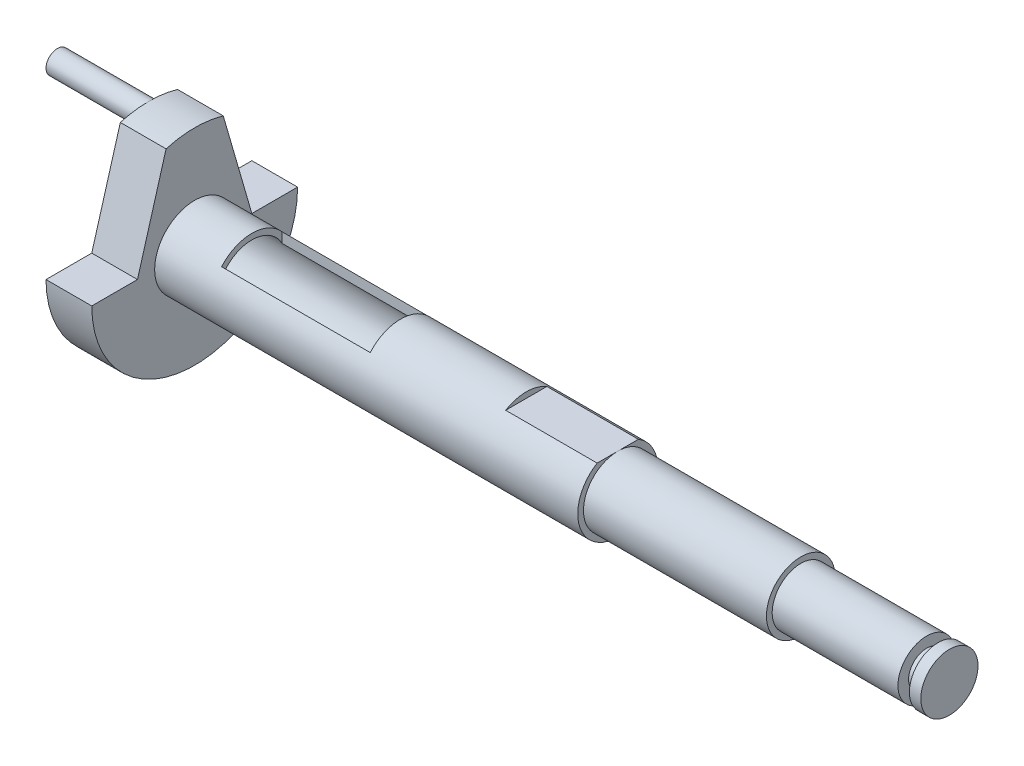
ISO-10303-21;
HEADER;
FILE_DESCRIPTION(('STEP AP214'),'2;1');
FILE_NAME('part.step','',(''),(''),'','','');
FILE_SCHEMA(('AUTOMOTIVE_DESIGN { 1 0 10303 214 1 1 1 1 }'));
ENDSEC;
DATA;
#1=APPLICATION_CONTEXT('core data for automotive mechanical design processes');
#2=APPLICATION_PROTOCOL_DEFINITION('international standard','automotive_design',2000,#1);
#3=PRODUCT_CONTEXT('',#1,'mechanical');
#4=PRODUCT('Part','Part','',(#3));
#5=PRODUCT_RELATED_PRODUCT_CATEGORY('part','',(#4));
#6=PRODUCT_DEFINITION_FORMATION('','',#4);
#7=PRODUCT_DEFINITION_CONTEXT('part definition',#1,'design');
#8=PRODUCT_DEFINITION('design','',#6,#7);
#9=PRODUCT_DEFINITION_SHAPE('','',#8);
#10=(LENGTH_UNIT() NAMED_UNIT(*) SI_UNIT(.MILLI.,.METRE.));
#11=(NAMED_UNIT(*) PLANE_ANGLE_UNIT() SI_UNIT($,.RADIAN.));
#12=(NAMED_UNIT(*) SI_UNIT($,.STERADIAN.) SOLID_ANGLE_UNIT());
#13=UNCERTAINTY_MEASURE_WITH_UNIT(LENGTH_MEASURE(1.E-05),#10,'distance_accuracy_value','');
#14=(GEOMETRIC_REPRESENTATION_CONTEXT(3) GLOBAL_UNCERTAINTY_ASSIGNED_CONTEXT((#13)) GLOBAL_UNIT_ASSIGNED_CONTEXT((#10,
#11,#12)) REPRESENTATION_CONTEXT('',''));
#15=CARTESIAN_POINT('',(0.,0.,0.));
#16=DIRECTION('',(0.,0.,1.));
#17=DIRECTION('',(1.,0.,0.));
#18=AXIS2_PLACEMENT_3D('',#15,#16,#17);
#19=CARTESIAN_POINT('',(-65.,0.,0.));
#20=DIRECTION('',(-1.,0.,0.));
#21=DIRECTION('',(0.,0.,1.));
#22=AXIS2_PLACEMENT_3D('',#19,#20,#21);
#23=PLANE('',#22);
#24=CARTESIAN_POINT('',(-65.,0.,0.));
#25=DIRECTION('',(-1.,0.,0.));
#26=DIRECTION('',(0.,0.,1.));
#27=AXIS2_PLACEMENT_3D('',#24,#25,#26);
#28=CIRCLE('',#27,3.5);
#29=CARTESIAN_POINT('',(-65.,0.,3.50000000000001));
#30=VERTEX_POINT('',#29);
#31=EDGE_CURVE('E193',#30,#30,#28,.T.);
#32=ORIENTED_EDGE('',*,*,#31,.T.);
#33=EDGE_LOOP('',(#32));
#34=FACE_BOUND('',#33,.T.);
#35=CARTESIAN_POINT('',(-65.,0.,0.));
#36=DIRECTION('',(-1.,0.,0.));
#37=DIRECTION('',(0.,0.,1.));
#38=AXIS2_PLACEMENT_3D('',#35,#36,#37);
#39=CIRCLE('',#38,9.);
#40=CARTESIAN_POINT('',(-65.,0.,-9.));
#41=VERTEX_POINT('',#40);
#42=CARTESIAN_POINT('',(-65.,0.,8.99999999999994));
#43=VERTEX_POINT('',#42);
#44=EDGE_CURVE('E158',#41,#43,#39,.T.);
#45=ORIENTED_EDGE('',*,*,#44,.F.);
#46=DIRECTION('',(0.,0.,1.));
#47=VECTOR('',#46,1.);
#48=CARTESIAN_POINT('',(-65.,0.,0.));
#49=LINE('',#48,#47);
#50=CARTESIAN_POINT('',(-65.,0.,-5.));
#51=VERTEX_POINT('',#50);
#52=EDGE_CURVE('E535',#41,#51,#49,.T.);
#53=ORIENTED_EDGE('',*,*,#52,.T.);
#54=DIRECTION('',(0.,0.960645359210589,0.277777777777778));
#55=VECTOR('',#54,1.);
#56=CARTESIAN_POINT('',(-65.,1.33422966557028,-4.61419753086421));
#57=LINE('',#56,#55);
#58=CARTESIAN_POINT('',(-65.,8.64580823289532,-2.5));
#59=VERTEX_POINT('',#58);
#60=EDGE_CURVE('E538',#51,#59,#57,.T.);
#61=ORIENTED_EDGE('',*,*,#60,.T.);
#62=CARTESIAN_POINT('',(-65.,8.6458082328953,2.49999999999995));
#63=VERTEX_POINT('',#62);
#64=EDGE_CURVE('E153',#63,#59,#39,.T.);
#65=ORIENTED_EDGE('',*,*,#64,.F.);
#66=DIRECTION('',(0.,0.960645359210589,-0.277777777777778));
#67=VECTOR('',#66,1.);
#68=CARTESIAN_POINT('',(-65.,1.33422966557026,4.61419753086419));
#69=LINE('',#68,#67);
#70=CARTESIAN_POINT('',(-65.,0.,4.99999999999994));
#71=VERTEX_POINT('',#70);
#72=EDGE_CURVE('E552',#71,#63,#69,.T.);
#73=ORIENTED_EDGE('',*,*,#72,.F.);
#74=DIRECTION('',(0.,0.,-1.));
#75=VECTOR('',#74,1.);
#76=CARTESIAN_POINT('',(-65.,0.,0.));
#77=LINE('',#76,#75);
#78=EDGE_CURVE('E554',#43,#71,#77,.T.);
#79=ORIENTED_EDGE('',*,*,#78,.F.);
#80=EDGE_LOOP('',(#45,#53,#61,#65,#73,#79));
#81=FACE_BOUND('',#80,.T.);
#82=ADVANCED_FACE('F40',(#34,#81),#23,.F.);
#83=CARTESIAN_POINT('',(-69.,0.,0.));
#84=DIRECTION('',(-1.,0.,0.));
#85=DIRECTION('',(0.,0.,1.));
#86=AXIS2_PLACEMENT_3D('',#83,#84,#85);
#87=PLANE('',#86);
#88=CARTESIAN_POINT('',(-69.,0.,0.));
#89=DIRECTION('',(-1.,0.,0.));
#90=DIRECTION('',(0.,0.,1.));
#91=AXIS2_PLACEMENT_3D('',#88,#89,#90);
#92=CIRCLE('',#91,9.);
#93=CARTESIAN_POINT('',(-69.,8.6458082328953,2.49999999999995));
#94=VERTEX_POINT('',#93);
#95=CARTESIAN_POINT('',(-69.,9.,0.));
#96=VERTEX_POINT('',#95);
#97=EDGE_CURVE('E136',#94,#96,#92,.T.);
#98=ORIENTED_EDGE('',*,*,#97,.T.);
#99=CARTESIAN_POINT('',(-69.,8.00000000000006,0.));
#100=DIRECTION('',(-1.,0.,0.));
#101=DIRECTION('',(0.,0.,1.));
#102=AXIS2_PLACEMENT_3D('',#99,#100,#101);
#103=CIRCLE('',#102,1.);
#104=EDGE_CURVE('E140',#96,#96,#103,.T.);
#105=ORIENTED_EDGE('',*,*,#104,.F.);
#106=CARTESIAN_POINT('',(-69.,8.64580823289532,-2.5));
#107=VERTEX_POINT('',#106);
#108=EDGE_CURVE('E55',#96,#107,#92,.T.);
#109=ORIENTED_EDGE('',*,*,#108,.T.);
#110=DIRECTION('',(0.,0.960645359210589,0.277777777777778));
#111=VECTOR('',#110,1.);
#112=CARTESIAN_POINT('',(-69.,1.33422966557028,-4.61419753086421));
#113=LINE('',#112,#111);
#114=CARTESIAN_POINT('',(-69.,0.,-5.));
#115=VERTEX_POINT('',#114);
#116=EDGE_CURVE('E539',#115,#107,#113,.T.);
#117=ORIENTED_EDGE('',*,*,#116,.F.);
#118=DIRECTION('',(0.,0.,1.));
#119=VECTOR('',#118,1.);
#120=CARTESIAN_POINT('',(-69.,0.,0.));
#121=LINE('',#120,#119);
#122=CARTESIAN_POINT('',(-69.,0.,-9.));
#123=VERTEX_POINT('',#122);
#124=EDGE_CURVE('E543',#123,#115,#121,.T.);
#125=ORIENTED_EDGE('',*,*,#124,.F.);
#126=CARTESIAN_POINT('',(-69.,0.,8.99999999999994));
#127=VERTEX_POINT('',#126);
#128=EDGE_CURVE('E147',#123,#127,#92,.T.);
#129=ORIENTED_EDGE('',*,*,#128,.T.);
#130=DIRECTION('',(0.,0.,-1.));
#131=VECTOR('',#130,1.);
#132=CARTESIAN_POINT('',(-69.,0.,0.));
#133=LINE('',#132,#131);
#134=CARTESIAN_POINT('',(-69.,0.,4.99999999999994));
#135=VERTEX_POINT('',#134);
#136=EDGE_CURVE('E63',#127,#135,#133,.T.);
#137=ORIENTED_EDGE('',*,*,#136,.T.);
#138=DIRECTION('',(0.,0.960645359210589,-0.277777777777778));
#139=VECTOR('',#138,1.);
#140=CARTESIAN_POINT('',(-69.,1.33422966557026,4.61419753086419));
#141=LINE('',#140,#139);
#142=EDGE_CURVE('E142',#135,#94,#141,.T.);
#143=ORIENTED_EDGE('',*,*,#142,.T.);
#144=EDGE_LOOP('',(#98,#105,#109,#117,#125,#129,#137,#143));
#145=FACE_BOUND('',#144,.T.);
#146=CARTESIAN_POINT('',(-69.,0.,0.));
#147=DIRECTION('',(-1.,0.,0.));
#148=DIRECTION('',(0.,0.,1.));
#149=AXIS2_PLACEMENT_3D('',#146,#147,#148);
#150=CIRCLE('',#149,3.);
#151=CARTESIAN_POINT('',(-69.,0.,3.00000000000001));
#152=VERTEX_POINT('',#151);
#153=EDGE_CURVE('E156',#152,#152,#150,.T.);
#154=ORIENTED_EDGE('',*,*,#153,.F.);
#155=EDGE_LOOP('',(#154));
#156=FACE_BOUND('',#155,.T.);
#157=ADVANCED_FACE('F137',(#145,#156),#87,.T.);
#158=CARTESIAN_POINT('',(-69.,0.,0.));
#159=DIRECTION('',(1.,0.,0.));
#160=DIRECTION('',(0.,0.,-1.));
#161=AXIS2_PLACEMENT_3D('',#158,#159,#160);
#162=CYLINDRICAL_SURFACE('',#161,9.);
#163=ORIENTED_EDGE('',*,*,#128,.F.);
#164=DIRECTION('',(-1.,0.,0.));
#165=VECTOR('',#164,1.);
#166=CARTESIAN_POINT('',(-65.,0.,-9.));
#167=LINE('',#166,#165);
#168=EDGE_CURVE('E548',#41,#123,#167,.T.);
#169=ORIENTED_EDGE('',*,*,#168,.F.);
#170=ORIENTED_EDGE('',*,*,#44,.T.);
#171=DIRECTION('',(-1.,0.,0.));
#172=VECTOR('',#171,1.);
#173=CARTESIAN_POINT('',(-65.,0.,8.99999999999994));
#174=LINE('',#173,#172);
#175=EDGE_CURVE('E559',#43,#127,#174,.T.);
#176=ORIENTED_EDGE('',*,*,#175,.T.);
#177=EDGE_LOOP('',(#163,#169,#170,#176));
#178=FACE_BOUND('',#177,.T.);
#179=ADVANCED_FACE('F265',(#178),#162,.T.);
#180=ORIENTED_EDGE('',*,*,#64,.T.);
#181=DIRECTION('',(-1.,0.,0.));
#182=VECTOR('',#181,1.);
#183=CARTESIAN_POINT('',(-65.,8.64580823289532,-2.5));
#184=LINE('',#183,#182);
#185=EDGE_CURVE('E151',#59,#107,#184,.T.);
#186=ORIENTED_EDGE('',*,*,#185,.T.);
#187=ORIENTED_EDGE('',*,*,#108,.F.);
#188=ORIENTED_EDGE('',*,*,#97,.F.);
#189=DIRECTION('',(-1.,0.,0.));
#190=VECTOR('',#189,1.);
#191=CARTESIAN_POINT('',(-65.,8.6458082328953,2.49999999999995));
#192=LINE('',#191,#190);
#193=EDGE_CURVE('E546',#63,#94,#192,.T.);
#194=ORIENTED_EDGE('',*,*,#193,.F.);
#195=EDGE_LOOP('',(#180,#186,#187,#188,#194));
#196=FACE_BOUND('',#195,.T.);
#197=ADVANCED_FACE('F150',(#196),#162,.T.);
#198=CARTESIAN_POINT('',(1.,0.,0.));
#199=DIRECTION('',(-1.,0.,0.));
#200=DIRECTION('',(0.,0.,1.));
#201=AXIS2_PLACEMENT_3D('',#198,#199,#200);
#202=CYLINDRICAL_SURFACE('',#201,2.5);
#203=CARTESIAN_POINT('',(1.,0.,0.));
#204=DIRECTION('',(1.,0.,0.));
#205=DIRECTION('',(0.,0.,-1.));
#206=AXIS2_PLACEMENT_3D('',#203,#204,#205);
#207=CIRCLE('',#206,2.5);
#208=CARTESIAN_POINT('',(1.,0.,-2.5));
#209=VERTEX_POINT('',#208);
#210=EDGE_CURVE('E230',#209,#209,#207,.T.);
#211=ORIENTED_EDGE('',*,*,#210,.F.);
#212=EDGE_LOOP('',(#211));
#213=FACE_BOUND('',#212,.T.);
#214=CARTESIAN_POINT('',(0.,0.,0.));
#215=DIRECTION('',(1.,0.,0.));
#216=DIRECTION('',(0.,0.,-1.));
#217=AXIS2_PLACEMENT_3D('',#214,#215,#216);
#218=CIRCLE('',#217,2.5);
#219=CARTESIAN_POINT('',(0.,0.,-2.5));
#220=VERTEX_POINT('',#219);
#221=EDGE_CURVE('E225',#220,#220,#218,.T.);
#222=ORIENTED_EDGE('',*,*,#221,.T.);
#223=EDGE_LOOP('',(#222));
#224=FACE_BOUND('',#223,.T.);
#225=ADVANCED_FACE('F42',(#213,#224),#202,.T.);
#226=CARTESIAN_POINT('',(1.,0.,0.));
#227=DIRECTION('',(1.,0.,0.));
#228=DIRECTION('',(0.,0.,-1.));
#229=AXIS2_PLACEMENT_3D('',#226,#227,#228);
#230=PLANE('',#229);
#231=ORIENTED_EDGE('',*,*,#210,.T.);
#232=EDGE_LOOP('',(#231));
#233=FACE_BOUND('',#232,.T.);
#234=ADVANCED_FACE('F325',(#233),#230,.T.);
#235=CARTESIAN_POINT('',(0.,0.,0.));
#236=DIRECTION('',(1.,0.,0.));
#237=DIRECTION('',(0.,0.,-1.));
#238=AXIS2_PLACEMENT_3D('',#235,#236,#237);
#239=PLANE('',#238);
#240=CARTESIAN_POINT('',(0.,0.,0.));
#241=DIRECTION('',(-1.,0.,0.));
#242=DIRECTION('',(0.,0.,1.));
#243=AXIS2_PLACEMENT_3D('',#240,#241,#242);
#244=CIRCLE('',#243,1.57);
#245=CARTESIAN_POINT('',(0.,0.,1.57));
#246=VERTEX_POINT('',#245);
#247=EDGE_CURVE('E226',#246,#246,#244,.T.);
#248=ORIENTED_EDGE('',*,*,#247,.F.);
#249=EDGE_LOOP('',(#248));
#250=FACE_BOUND('',#249,.T.);
#251=ORIENTED_EDGE('',*,*,#221,.F.);
#252=EDGE_LOOP('',(#251));
#253=FACE_BOUND('',#252,.T.);
#254=ADVANCED_FACE('F323',(#250,#253),#239,.F.);
#255=CARTESIAN_POINT('',(-1.,0.,0.));
#256=DIRECTION('',(1.,0.,0.));
#257=DIRECTION('',(0.,0.,-1.));
#258=AXIS2_PLACEMENT_3D('',#255,#256,#257);
#259=CYLINDRICAL_SURFACE('',#258,1.57);
#260=CARTESIAN_POINT('',(-1.,0.,0.));
#261=DIRECTION('',(-1.,0.,0.));
#262=DIRECTION('',(0.,0.,1.));
#263=AXIS2_PLACEMENT_3D('',#260,#261,#262);
#264=CIRCLE('',#263,1.57);
#265=CARTESIAN_POINT('',(-1.,0.,1.57));
#266=VERTEX_POINT('',#265);
#267=EDGE_CURVE('E220',#266,#266,#264,.T.);
#268=ORIENTED_EDGE('',*,*,#267,.F.);
#269=EDGE_LOOP('',(#268));
#270=FACE_BOUND('',#269,.T.);
#271=ORIENTED_EDGE('',*,*,#247,.T.);
#272=EDGE_LOOP('',(#271));
#273=FACE_BOUND('',#272,.T.);
#274=ADVANCED_FACE('F319',(#270,#273),#259,.T.);
#275=CARTESIAN_POINT('',(-12.,0.,0.));
#276=DIRECTION('',(1.,0.,0.));
#277=DIRECTION('',(0.,0.,-1.));
#278=AXIS2_PLACEMENT_3D('',#275,#276,#277);
#279=CYLINDRICAL_SURFACE('',#278,2.5);
#280=CARTESIAN_POINT('',(-12.,0.,0.));
#281=DIRECTION('',(-1.,0.,0.));
#282=DIRECTION('',(0.,0.,1.));
#283=AXIS2_PLACEMENT_3D('',#280,#281,#282);
#284=CIRCLE('',#283,2.5);
#285=CARTESIAN_POINT('',(-12.,0.,2.5));
#286=VERTEX_POINT('',#285);
#287=EDGE_CURVE('E217',#286,#286,#284,.T.);
#288=ORIENTED_EDGE('',*,*,#287,.F.);
#289=EDGE_LOOP('',(#288));
#290=FACE_BOUND('',#289,.T.);
#291=CARTESIAN_POINT('',(-1.,0.,0.));
#292=DIRECTION('',(-1.,0.,0.));
#293=DIRECTION('',(0.,0.,1.));
#294=AXIS2_PLACEMENT_3D('',#291,#292,#293);
#295=CIRCLE('',#294,2.5);
#296=CARTESIAN_POINT('',(-1.,0.,2.5));
#297=VERTEX_POINT('',#296);
#298=EDGE_CURVE('E214',#297,#297,#295,.T.);
#299=ORIENTED_EDGE('',*,*,#298,.T.);
#300=EDGE_LOOP('',(#299));
#301=FACE_BOUND('',#300,.T.);
#302=ADVANCED_FACE('F315',(#290,#301),#279,.T.);
#303=CARTESIAN_POINT('',(-1.,0.,0.));
#304=DIRECTION('',(-1.,0.,0.));
#305=DIRECTION('',(0.,0.,1.));
#306=AXIS2_PLACEMENT_3D('',#303,#304,#305);
#307=PLANE('',#306);
#308=ORIENTED_EDGE('',*,*,#267,.T.);
#309=EDGE_LOOP('',(#308));
#310=FACE_BOUND('',#309,.T.);
#311=ORIENTED_EDGE('',*,*,#298,.F.);
#312=EDGE_LOOP('',(#311));
#313=FACE_BOUND('',#312,.T.);
#314=ADVANCED_FACE('F311',(#310,#313),#307,.F.);
#315=CARTESIAN_POINT('',(-28.,0.,0.));
#316=DIRECTION('',(1.,0.,0.));
#317=DIRECTION('',(0.,0.,-1.));
#318=AXIS2_PLACEMENT_3D('',#315,#316,#317);
#319=CYLINDRICAL_SURFACE('',#318,3.);
#320=CARTESIAN_POINT('',(-28.,0.,0.));
#321=DIRECTION('',(-1.,0.,0.));
#322=DIRECTION('',(0.,0.,1.));
#323=AXIS2_PLACEMENT_3D('',#320,#321,#322);
#324=CIRCLE('',#323,3.);
#325=CARTESIAN_POINT('',(-28.,3.00000000000001,0.));
#326=VERTEX_POINT('',#325);
#327=EDGE_CURVE('E211',#326,#326,#324,.T.);
#328=ORIENTED_EDGE('',*,*,#327,.F.);
#329=EDGE_LOOP('',(#328));
#330=FACE_BOUND('',#329,.T.);
#331=CARTESIAN_POINT('',(-12.,0.,0.));
#332=DIRECTION('',(-1.,0.,0.));
#333=DIRECTION('',(0.,0.,1.));
#334=AXIS2_PLACEMENT_3D('',#331,#332,#333);
#335=CIRCLE('',#334,3.);
#336=CARTESIAN_POINT('',(-12.,0.,3.00000000000001));
#337=VERTEX_POINT('',#336);
#338=EDGE_CURVE('E210',#337,#337,#335,.T.);
#339=ORIENTED_EDGE('',*,*,#338,.T.);
#340=EDGE_LOOP('',(#339));
#341=FACE_BOUND('',#340,.T.);
#342=ADVANCED_FACE('F305',(#330,#341),#319,.T.);
#343=CARTESIAN_POINT('',(-12.,0.,0.));
#344=DIRECTION('',(-1.,0.,0.));
#345=DIRECTION('',(0.,0.,1.));
#346=AXIS2_PLACEMENT_3D('',#343,#344,#345);
#347=PLANE('',#346);
#348=ORIENTED_EDGE('',*,*,#287,.T.);
#349=EDGE_LOOP('',(#348));
#350=FACE_BOUND('',#349,.T.);
#351=ORIENTED_EDGE('',*,*,#338,.F.);
#352=EDGE_LOOP('',(#351));
#353=FACE_BOUND('',#352,.T.);
#354=ADVANCED_FACE('F298',(#350,#353),#347,.F.);
#355=CARTESIAN_POINT('',(-36.,0.,0.));
#356=DIRECTION('',(1.,0.,0.));
#357=DIRECTION('',(0.,0.,-1.));
#358=AXIS2_PLACEMENT_3D('',#355,#356,#357);
#359=CYLINDRICAL_SURFACE('',#358,3.5);
#360=DIRECTION('',(1.,0.,0.));
#361=VECTOR('',#360,1.);
#362=CARTESIAN_POINT('',(-36.,2.29128784747792,2.64575131106459));
#363=LINE('',#362,#361);
#364=CARTESIAN_POINT('',(-47.,2.29128784747792,2.64575131106459));
#365=VERTEX_POINT('',#364);
#366=CARTESIAN_POINT('',(-60.,2.29128784747792,2.64575131106459));
#367=VERTEX_POINT('',#366);
#368=EDGE_CURVE('E174',#365,#367,#363,.F.);
#369=ORIENTED_EDGE('',*,*,#368,.T.);
#370=CARTESIAN_POINT('',(-60.,0.,0.));
#371=DIRECTION('',(-1.,0.,0.));
#372=DIRECTION('',(0.,0.,1.));
#373=AXIS2_PLACEMENT_3D('',#370,#371,#372);
#374=CIRCLE('',#373,3.5);
#375=CARTESIAN_POINT('',(-60.,2.29128784747792,-2.6457513110646));
#376=VERTEX_POINT('',#375);
#377=EDGE_CURVE('E186',#367,#376,#374,.T.);
#378=ORIENTED_EDGE('',*,*,#377,.T.);
#379=DIRECTION('',(1.,0.,0.));
#380=VECTOR('',#379,1.);
#381=CARTESIAN_POINT('',(-36.,2.29128784747792,-2.6457513110646));
#382=LINE('',#381,#380);
#383=CARTESIAN_POINT('',(-47.,2.29128784747792,-2.6457513110646));
#384=VERTEX_POINT('',#383);
#385=EDGE_CURVE('E180',#376,#384,#382,.T.);
#386=ORIENTED_EDGE('',*,*,#385,.T.);
#387=CARTESIAN_POINT('',(-47.,0.,0.));
#388=DIRECTION('',(1.,0.,0.));
#389=DIRECTION('',(0.,0.,-1.));
#390=AXIS2_PLACEMENT_3D('',#387,#388,#389);
#391=CIRCLE('',#390,3.5);
#392=EDGE_CURVE('E183',#384,#365,#391,.T.);
#393=ORIENTED_EDGE('',*,*,#392,.T.);
#394=EDGE_LOOP('',(#369,#378,#386,#393));
#395=FACE_BOUND('',#394,.T.);
#396=DIRECTION('',(1.,0.,0.));
#397=VECTOR('',#396,1.);
#398=CARTESIAN_POINT('',(-36.,3.00000000000003,1.80277563773199));
#399=LINE('',#398,#397);
#400=CARTESIAN_POINT('',(-28.,3.00000000000003,1.80277563773199));
#401=VERTEX_POINT('',#400);
#402=CARTESIAN_POINT('',(-36.,3.00000000000003,1.80277563773199));
#403=VERTEX_POINT('',#402);
#404=EDGE_CURVE('E201',#401,#403,#399,.F.);
#405=ORIENTED_EDGE('',*,*,#404,.T.);
#406=CARTESIAN_POINT('',(-36.,0.,0.));
#407=DIRECTION('',(-1.,0.,0.));
#408=DIRECTION('',(0.,0.,1.));
#409=AXIS2_PLACEMENT_3D('',#406,#407,#408);
#410=CIRCLE('',#409,3.5);
#411=CARTESIAN_POINT('',(-36.,3.,-1.802775637732));
#412=VERTEX_POINT('',#411);
#413=EDGE_CURVE('E192',#403,#412,#410,.T.);
#414=ORIENTED_EDGE('',*,*,#413,.T.);
#415=DIRECTION('',(1.,0.,0.));
#416=VECTOR('',#415,1.);
#417=CARTESIAN_POINT('',(-36.,3.,-1.802775637732));
#418=LINE('',#417,#416);
#419=CARTESIAN_POINT('',(-28.,3.,-1.802775637732));
#420=VERTEX_POINT('',#419);
#421=EDGE_CURVE('E204',#412,#420,#418,.T.);
#422=ORIENTED_EDGE('',*,*,#421,.T.);
#423=CARTESIAN_POINT('',(-28.,0.,0.));
#424=DIRECTION('',(-1.,0.,0.));
#425=DIRECTION('',(0.,0.,1.));
#426=AXIS2_PLACEMENT_3D('',#423,#424,#425);
#427=CIRCLE('',#426,3.5);
#428=EDGE_CURVE('E207',#420,#401,#427,.T.);
#429=ORIENTED_EDGE('',*,*,#428,.T.);
#430=EDGE_LOOP('',(#405,#414,#422,#429));
#431=FACE_BOUND('',#430,.T.);
#432=ORIENTED_EDGE('',*,*,#31,.F.);
#433=EDGE_LOOP('',(#432));
#434=FACE_BOUND('',#433,.T.);
#435=ADVANCED_FACE('F243',(#395,#431,#434),#359,.T.);
#436=CARTESIAN_POINT('',(-28.,0.,0.));
#437=DIRECTION('',(-1.,0.,0.));
#438=DIRECTION('',(0.,0.,1.));
#439=AXIS2_PLACEMENT_3D('',#436,#437,#438);
#440=PLANE('',#439);
#441=ORIENTED_EDGE('',*,*,#428,.F.);
#442=DIRECTION('',(0.,0.,1.));
#443=VECTOR('',#442,1.);
#444=CARTESIAN_POINT('',(-28.,3.00000000000001,0.));
#445=LINE('',#444,#443);
#446=EDGE_CURVE('E48',#420,#326,#445,.T.);
#447=ORIENTED_EDGE('',*,*,#446,.T.);
#448=ORIENTED_EDGE('',*,*,#327,.T.);
#449=EDGE_CURVE('E229',#326,#401,#445,.T.);
#450=ORIENTED_EDGE('',*,*,#449,.T.);
#451=EDGE_LOOP('',(#441,#447,#448,#450));
#452=FACE_BOUND('',#451,.T.);
#453=ADVANCED_FACE('F238',(#452),#440,.F.);
#454=CARTESIAN_POINT('',(-36.,3.00000000000003,4.10053810612848));
#455=DIRECTION('',(0.,-1.,0.));
#456=DIRECTION('',(0.,0.,-1.));
#457=AXIS2_PLACEMENT_3D('',#454,#455,#456);
#458=PLANE('',#457);
#459=DIRECTION('',(0.,0.,-1.));
#460=VECTOR('',#459,1.);
#461=CARTESIAN_POINT('',(-36.,3.00000000000003,4.10053810612848));
#462=LINE('',#461,#460);
#463=EDGE_CURVE('E196',#403,#412,#462,.T.);
#464=ORIENTED_EDGE('',*,*,#463,.F.);
#465=ORIENTED_EDGE('',*,*,#404,.F.);
#466=ORIENTED_EDGE('',*,*,#449,.F.);
#467=ORIENTED_EDGE('',*,*,#446,.F.);
#468=ORIENTED_EDGE('',*,*,#421,.F.);
#469=EDGE_LOOP('',(#464,#465,#466,#467,#468));
#470=FACE_BOUND('',#469,.T.);
#471=ADVANCED_FACE('F241',(#470),#458,.F.);
#472=CARTESIAN_POINT('',(-36.,0.,0.));
#473=DIRECTION('',(-1.,0.,0.));
#474=DIRECTION('',(0.,0.,1.));
#475=AXIS2_PLACEMENT_3D('',#472,#473,#474);
#476=PLANE('',#475);
#477=ORIENTED_EDGE('',*,*,#413,.F.);
#478=ORIENTED_EDGE('',*,*,#463,.T.);
#479=EDGE_LOOP('',(#477,#478));
#480=FACE_BOUND('',#479,.T.);
#481=ADVANCED_FACE('F247',(#480),#476,.F.);
#482=CARTESIAN_POINT('',(-47.,0.,0.));
#483=DIRECTION('',(-1.,0.,0.));
#484=DIRECTION('',(0.,0.,1.));
#485=AXIS2_PLACEMENT_3D('',#482,#483,#484);
#486=CYLINDRICAL_SURFACE('',#485,3.);
#487=CARTESIAN_POINT('',(-47.,0.,0.));
#488=DIRECTION('',(-1.,0.,0.));
#489=DIRECTION('',(0.,0.,1.));
#490=AXIS2_PLACEMENT_3D('',#487,#488,#489);
#491=CIRCLE('',#490,3.);
#492=CARTESIAN_POINT('',(-47.,1.4142135623731,-2.64575131106465));
#493=VERTEX_POINT('',#492);
#494=CARTESIAN_POINT('',(-47.,1.4142135623731,2.64575131106454));
#495=VERTEX_POINT('',#494);
#496=EDGE_CURVE('E189',#493,#495,#491,.T.);
#497=ORIENTED_EDGE('',*,*,#496,.F.);
#498=DIRECTION('',(-1.,0.,0.));
#499=VECTOR('',#498,1.);
#500=CARTESIAN_POINT('',(-47.,1.4142135623731,-2.64575131106465));
#501=LINE('',#500,#499);
#502=CARTESIAN_POINT('',(-60.,1.4142135623731,-2.64575131106464));
#503=VERTEX_POINT('',#502);
#504=EDGE_CURVE('E177',#493,#503,#501,.T.);
#505=ORIENTED_EDGE('',*,*,#504,.T.);
#506=CARTESIAN_POINT('',(-60.,0.,0.));
#507=DIRECTION('',(-1.,0.,0.));
#508=DIRECTION('',(0.,0.,1.));
#509=AXIS2_PLACEMENT_3D('',#506,#507,#508);
#510=CIRCLE('',#509,3.);
#511=CARTESIAN_POINT('',(-60.,1.4142135623731,2.64575131106454));
#512=VERTEX_POINT('',#511);
#513=EDGE_CURVE('E11',#503,#512,#510,.F.);
#514=ORIENTED_EDGE('',*,*,#513,.T.);
#515=DIRECTION('',(-1.,0.,0.));
#516=VECTOR('',#515,1.);
#517=CARTESIAN_POINT('',(-47.,1.4142135623731,2.64575131106454));
#518=LINE('',#517,#516);
#519=EDGE_CURVE('E164',#512,#495,#518,.F.);
#520=ORIENTED_EDGE('',*,*,#519,.T.);
#521=EDGE_LOOP('',(#497,#505,#514,#520));
#522=FACE_BOUND('',#521,.T.);
#523=ORIENTED_EDGE('',*,*,#153,.T.);
#524=EDGE_LOOP('',(#523));
#525=FACE_BOUND('',#524,.T.);
#526=ADVANCED_FACE('F249',(#522,#525),#486,.F.);
#527=CARTESIAN_POINT('',(-47.,0.,0.));
#528=DIRECTION('',(-1.,0.,0.));
#529=DIRECTION('',(0.,0.,1.));
#530=AXIS2_PLACEMENT_3D('',#527,#528,#529);
#531=PLANE('',#530);
#532=ORIENTED_EDGE('',*,*,#496,.T.);
#533=DIRECTION('',(0.,1.,0.));
#534=VECTOR('',#533,1.);
#535=CARTESIAN_POINT('',(-47.,1.,2.64575131106459));
#536=LINE('',#535,#534);
#537=EDGE_CURVE('E168',#495,#365,#536,.T.);
#538=ORIENTED_EDGE('',*,*,#537,.T.);
#539=ORIENTED_EDGE('',*,*,#392,.F.);
#540=DIRECTION('',(0.,1.,0.));
#541=VECTOR('',#540,1.);
#542=CARTESIAN_POINT('',(-47.,1.,-2.64575131106459));
#543=LINE('',#542,#541);
#544=EDGE_CURVE('E165',#493,#384,#543,.T.);
#545=ORIENTED_EDGE('',*,*,#544,.F.);
#546=EDGE_LOOP('',(#532,#538,#539,#545));
#547=FACE_BOUND('',#546,.T.);
#548=ADVANCED_FACE('F255',(#547),#531,.T.);
#549=CARTESIAN_POINT('',(-60.,1.,-2.64575131106459));
#550=DIRECTION('',(-1.,0.,0.));
#551=DIRECTION('',(0.,0.,1.));
#552=AXIS2_PLACEMENT_3D('',#549,#550,#551);
#553=PLANE('',#552);
#554=DIRECTION('',(0.,1.,0.));
#555=VECTOR('',#554,1.);
#556=CARTESIAN_POINT('',(-60.,1.,2.64575131106459));
#557=LINE('',#556,#555);
#558=EDGE_CURVE('E145',#512,#367,#557,.T.);
#559=ORIENTED_EDGE('',*,*,#558,.F.);
#560=ORIENTED_EDGE('',*,*,#513,.F.);
#561=DIRECTION('',(0.,1.,0.));
#562=VECTOR('',#561,1.);
#563=CARTESIAN_POINT('',(-60.,1.,-2.64575131106459));
#564=LINE('',#563,#562);
#565=EDGE_CURVE('E161',#503,#376,#564,.T.);
#566=ORIENTED_EDGE('',*,*,#565,.T.);
#567=ORIENTED_EDGE('',*,*,#377,.F.);
#568=EDGE_LOOP('',(#559,#560,#566,#567));
#569=FACE_BOUND('',#568,.T.);
#570=ADVANCED_FACE('F277',(#569),#553,.F.);
#571=CARTESIAN_POINT('',(-47.,1.,-2.64575131106459));
#572=DIRECTION('',(0.,0.,-1.));
#573=DIRECTION('',(-1.,0.,0.));
#574=AXIS2_PLACEMENT_3D('',#571,#572,#573);
#575=PLANE('',#574);
#576=ORIENTED_EDGE('',*,*,#565,.F.);
#577=ORIENTED_EDGE('',*,*,#504,.F.);
#578=ORIENTED_EDGE('',*,*,#544,.T.);
#579=ORIENTED_EDGE('',*,*,#385,.F.);
#580=EDGE_LOOP('',(#576,#577,#578,#579));
#581=FACE_BOUND('',#580,.T.);
#582=ADVANCED_FACE('F273',(#581),#575,.F.);
#583=CARTESIAN_POINT('',(-60.,1.,2.64575131106459));
#584=DIRECTION('',(0.,0.,1.));
#585=DIRECTION('',(1.,0.,0.));
#586=AXIS2_PLACEMENT_3D('',#583,#584,#585);
#587=PLANE('',#586);
#588=ORIENTED_EDGE('',*,*,#537,.F.);
#589=ORIENTED_EDGE('',*,*,#519,.F.);
#590=ORIENTED_EDGE('',*,*,#558,.T.);
#591=ORIENTED_EDGE('',*,*,#368,.F.);
#592=EDGE_LOOP('',(#588,#589,#590,#591));
#593=FACE_BOUND('',#592,.T.);
#594=ADVANCED_FACE('F276',(#593),#587,.F.);
#595=CARTESIAN_POINT('',(-65.,1.33422966557026,4.61419753086419));
#596=DIRECTION('',(0.,0.277777777777778,0.960645359210589));
#597=DIRECTION('',(0.,-0.960645359210589,0.277777777777778));
#598=AXIS2_PLACEMENT_3D('',#595,#596,#597);
#599=PLANE('',#598);
#600=ORIENTED_EDGE('',*,*,#142,.F.);
#601=DIRECTION('',(-1.,0.,0.));
#602=VECTOR('',#601,1.);
#603=CARTESIAN_POINT('',(-65.,0.,4.99999999999994));
#604=LINE('',#603,#602);
#605=EDGE_CURVE('E555',#71,#135,#604,.T.);
#606=ORIENTED_EDGE('',*,*,#605,.F.);
#607=ORIENTED_EDGE('',*,*,#72,.T.);
#608=ORIENTED_EDGE('',*,*,#193,.T.);
#609=EDGE_LOOP('',(#600,#606,#607,#608));
#610=FACE_BOUND('',#609,.T.);
#611=ADVANCED_FACE('F281',(#610),#599,.T.);
#612=CARTESIAN_POINT('',(-65.,0.,0.));
#613=DIRECTION('',(0.,1.,0.));
#614=DIRECTION('',(0.,0.,1.));
#615=AXIS2_PLACEMENT_3D('',#612,#613,#614);
#616=PLANE('',#615);
#617=ORIENTED_EDGE('',*,*,#136,.F.);
#618=ORIENTED_EDGE('',*,*,#175,.F.);
#619=ORIENTED_EDGE('',*,*,#78,.T.);
#620=ORIENTED_EDGE('',*,*,#605,.T.);
#621=EDGE_LOOP('',(#617,#618,#619,#620));
#622=FACE_BOUND('',#621,.T.);
#623=ADVANCED_FACE('F366',(#622),#616,.T.);
#624=CARTESIAN_POINT('',(-65.,0.,0.));
#625=DIRECTION('',(0.,-1.,0.));
#626=DIRECTION('',(0.,0.,-1.));
#627=AXIS2_PLACEMENT_3D('',#624,#625,#626);
#628=PLANE('',#627);
#629=ORIENTED_EDGE('',*,*,#124,.T.);
#630=DIRECTION('',(-1.,0.,0.));
#631=VECTOR('',#630,1.);
#632=CARTESIAN_POINT('',(-65.,0.,-5.));
#633=LINE('',#632,#631);
#634=EDGE_CURVE('E542',#51,#115,#633,.T.);
#635=ORIENTED_EDGE('',*,*,#634,.F.);
#636=ORIENTED_EDGE('',*,*,#52,.F.);
#637=ORIENTED_EDGE('',*,*,#168,.T.);
#638=EDGE_LOOP('',(#629,#635,#636,#637));
#639=FACE_BOUND('',#638,.T.);
#640=ADVANCED_FACE('F375',(#639),#628,.F.);
#641=CARTESIAN_POINT('',(-65.,1.33422966557028,-4.61419753086421));
#642=DIRECTION('',(0.,-0.277777777777778,0.960645359210589));
#643=DIRECTION('',(0.,-0.960645359210589,-0.277777777777778));
#644=AXIS2_PLACEMENT_3D('',#641,#642,#643);
#645=PLANE('',#644);
#646=ORIENTED_EDGE('',*,*,#116,.T.);
#647=ORIENTED_EDGE('',*,*,#185,.F.);
#648=ORIENTED_EDGE('',*,*,#60,.F.);
#649=ORIENTED_EDGE('',*,*,#634,.T.);
#650=EDGE_LOOP('',(#646,#647,#648,#649));
#651=FACE_BOUND('',#650,.T.);
#652=ADVANCED_FACE('F383',(#651),#645,.F.);
#653=CARTESIAN_POINT('',(-77.,8.00000000000006,0.));
#654=DIRECTION('',(1.,0.,0.));
#655=DIRECTION('',(0.,0.,-1.));
#656=AXIS2_PLACEMENT_3D('',#653,#654,#655);
#657=CYLINDRICAL_SURFACE('',#656,1.);
#658=CARTESIAN_POINT('',(-77.,8.00000000000006,0.));
#659=DIRECTION('',(-1.,0.,0.));
#660=DIRECTION('',(0.,0.,1.));
#661=AXIS2_PLACEMENT_3D('',#658,#659,#660);
#662=CIRCLE('',#661,1.);
#663=CARTESIAN_POINT('',(-77.,8.00000000000006,1.));
#664=VERTEX_POINT('',#663);
#665=EDGE_CURVE('E530',#664,#664,#662,.T.);
#666=ORIENTED_EDGE('',*,*,#665,.F.);
#667=EDGE_LOOP('',(#666));
#668=FACE_BOUND('',#667,.T.);
#669=ORIENTED_EDGE('',*,*,#104,.T.);
#670=EDGE_LOOP('',(#669));
#671=FACE_BOUND('',#670,.T.);
#672=ADVANCED_FACE('F392',(#668,#671),#657,.T.);
#673=CARTESIAN_POINT('',(-77.,8.00000000000006,0.));
#674=DIRECTION('',(-1.,0.,0.));
#675=DIRECTION('',(0.,0.,1.));
#676=AXIS2_PLACEMENT_3D('',#673,#674,#675);
#677=PLANE('',#676);
#678=ORIENTED_EDGE('',*,*,#665,.T.);
#679=EDGE_LOOP('',(#678));
#680=FACE_BOUND('',#679,.T.);
#681=ADVANCED_FACE('F401',(#680),#677,.T.);
#682=CLOSED_SHELL('',(#82,#157,#179,#197,#225,#234,#254,#274,#302,#314,#342,#354,#435,#453,#471,
#481,#526,#548,#570,#582,#594,#611,#623,#640,#652,#672,#681));
#683=MANIFOLD_SOLID_BREP('B2',#682);
#684=ADVANCED_BREP_SHAPE_REPRESENTATION('',(#18,#683),#14);
#685=SHAPE_DEFINITION_REPRESENTATION(#9,#684);
ENDSEC;
END-ISO-10303-21;
